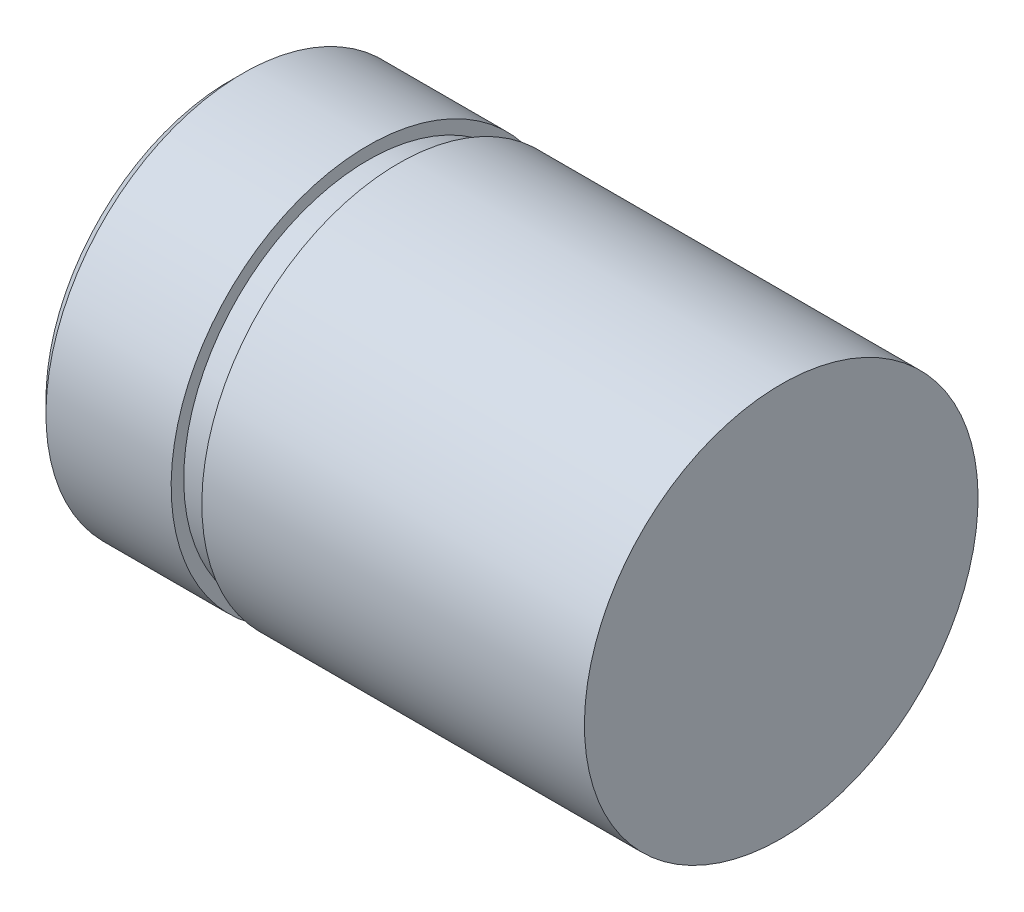
ISO-10303-21;
HEADER;
FILE_DESCRIPTION(('STEP AP214'),'2;1');
FILE_NAME('part.step','',(''),(''),'','','');
FILE_SCHEMA(('AUTOMOTIVE_DESIGN { 1 0 10303 214 1 1 1 1 }'));
ENDSEC;
DATA;
#1=APPLICATION_CONTEXT('core data for automotive mechanical design processes');
#2=APPLICATION_PROTOCOL_DEFINITION('international standard','automotive_design',2000,#1);
#3=PRODUCT_CONTEXT('',#1,'mechanical');
#4=PRODUCT('Part','Part','',(#3));
#5=PRODUCT_RELATED_PRODUCT_CATEGORY('part','',(#4));
#6=PRODUCT_DEFINITION_FORMATION('','',#4);
#7=PRODUCT_DEFINITION_CONTEXT('part definition',#1,'design');
#8=PRODUCT_DEFINITION('design','',#6,#7);
#9=PRODUCT_DEFINITION_SHAPE('','',#8);
#10=(LENGTH_UNIT() NAMED_UNIT(*) SI_UNIT(.MILLI.,.METRE.));
#11=(NAMED_UNIT(*) PLANE_ANGLE_UNIT() SI_UNIT($,.RADIAN.));
#12=(NAMED_UNIT(*) SI_UNIT($,.STERADIAN.) SOLID_ANGLE_UNIT());
#13=UNCERTAINTY_MEASURE_WITH_UNIT(LENGTH_MEASURE(1.E-05),#10,'distance_accuracy_value','');
#14=(GEOMETRIC_REPRESENTATION_CONTEXT(3) GLOBAL_UNCERTAINTY_ASSIGNED_CONTEXT((#13)) GLOBAL_UNIT_ASSIGNED_CONTEXT((#10,
#11,#12)) REPRESENTATION_CONTEXT('',''));
#15=CARTESIAN_POINT('',(0.,0.,0.));
#16=DIRECTION('',(0.,0.,1.));
#17=DIRECTION('',(1.,0.,0.));
#18=AXIS2_PLACEMENT_3D('',#15,#16,#17);
#19=CARTESIAN_POINT('',(-4.9403,-5.94360000000001,0.));
#20=DIRECTION('',(-1.,0.,0.));
#21=DIRECTION('',(0.,-1.,0.));
#22=AXIS2_PLACEMENT_3D('',#19,#20,#21);
#23=PLANE('',#22);
#24=CARTESIAN_POINT('',(-4.9403,0.,0.));
#25=DIRECTION('',(-1.,0.,0.));
#26=DIRECTION('',(0.,-1.,0.));
#27=AXIS2_PLACEMENT_3D('',#24,#25,#26);
#28=CIRCLE('',#27,5.94360000000001);
#29=CARTESIAN_POINT('',(-4.9403,-5.94360000000001,0.));
#30=VERTEX_POINT('',#29);
#31=EDGE_CURVE('E10',#30,#30,#28,.T.);
#32=ORIENTED_EDGE('',*,*,#31,.T.);
#33=EDGE_LOOP('',(#32));
#34=FACE_BOUND('',#33,.T.);
#35=ADVANCED_FACE('F34',(#34),#23,.T.);
#36=CARTESIAN_POINT('',(-4.9403,0.,0.));
#37=DIRECTION('',(1.,0.,0.));
#38=DIRECTION('',(0.,1.,0.));
#39=AXIS2_PLACEMENT_3D('',#36,#37,#38);
#40=CONICAL_SURFACE('',#39,5.94360000000001,0.78539816339744);
#41=CARTESIAN_POINT('',(-4.53390000000003,0.,0.));
#42=DIRECTION('',(-1.,0.,0.));
#43=DIRECTION('',(0.,-1.,0.));
#44=AXIS2_PLACEMENT_3D('',#41,#42,#43);
#45=CIRCLE('',#44,6.34999999999997);
#46=CARTESIAN_POINT('',(-4.53390000000003,-6.34999999999997,0.));
#47=VERTEX_POINT('',#46);
#48=EDGE_CURVE('E40',#47,#47,#45,.T.);
#49=ORIENTED_EDGE('',*,*,#48,.T.);
#50=EDGE_LOOP('',(#49));
#51=FACE_BOUND('',#50,.T.);
#52=ORIENTED_EDGE('',*,*,#31,.F.);
#53=EDGE_LOOP('',(#52));
#54=FACE_BOUND('',#53,.T.);
#55=ADVANCED_FACE('F75',(#51,#54),#40,.T.);
#56=CARTESIAN_POINT('',(12.8397,0.,0.));
#57=DIRECTION('',(-1.,0.,0.));
#58=DIRECTION('',(0.,-1.,0.));
#59=AXIS2_PLACEMENT_3D('',#56,#57,#58);
#60=CYLINDRICAL_SURFACE('',#59,6.34999999999997);
#61=CARTESIAN_POINT('',(-0.495300000000001,0.,0.));
#62=DIRECTION('',(-1.,0.,0.));
#63=DIRECTION('',(0.,-1.,0.));
#64=AXIS2_PLACEMENT_3D('',#61,#62,#63);
#65=CIRCLE('',#64,6.34999999999997);
#66=CARTESIAN_POINT('',(-0.495300000000001,-6.34999999999997,0.));
#67=VERTEX_POINT('',#66);
#68=EDGE_CURVE('E44',#67,#67,#65,.T.);
#69=ORIENTED_EDGE('',*,*,#68,.T.);
#70=EDGE_LOOP('',(#69));
#71=FACE_BOUND('',#70,.T.);
#72=ORIENTED_EDGE('',*,*,#48,.F.);
#73=EDGE_LOOP('',(#72));
#74=FACE_BOUND('',#73,.T.);
#75=ADVANCED_FACE('F79',(#71,#74),#60,.T.);
#76=CARTESIAN_POINT('',(-0.495300000000002,-5.94360000000001,0.));
#77=DIRECTION('',(1.,0.,0.));
#78=DIRECTION('',(0.,1.,0.));
#79=AXIS2_PLACEMENT_3D('',#76,#77,#78);
#80=PLANE('',#79);
#81=CARTESIAN_POINT('',(-0.495300000000004,0.,0.));
#82=DIRECTION('',(-1.,0.,0.));
#83=DIRECTION('',(0.,-1.,0.));
#84=AXIS2_PLACEMENT_3D('',#81,#82,#83);
#85=CIRCLE('',#84,5.94360000000001);
#86=CARTESIAN_POINT('',(-0.495300000000004,-5.94360000000001,0.));
#87=VERTEX_POINT('',#86);
#88=EDGE_CURVE('E48',#87,#87,#85,.T.);
#89=ORIENTED_EDGE('',*,*,#88,.T.);
#90=EDGE_LOOP('',(#89));
#91=FACE_BOUND('',#90,.T.);
#92=ORIENTED_EDGE('',*,*,#68,.F.);
#93=EDGE_LOOP('',(#92));
#94=FACE_BOUND('',#93,.T.);
#95=ADVANCED_FACE('F83',(#91,#94),#80,.T.);
#96=CARTESIAN_POINT('',(12.8397,0.,0.));
#97=DIRECTION('',(-1.,0.,0.));
#98=DIRECTION('',(0.,-1.,0.));
#99=AXIS2_PLACEMENT_3D('',#96,#97,#98);
#100=CYLINDRICAL_SURFACE('',#99,5.94360000000001);
#101=CARTESIAN_POINT('',(0.495300000000004,0.,0.));
#102=DIRECTION('',(-1.,0.,0.));
#103=DIRECTION('',(0.,-1.,0.));
#104=AXIS2_PLACEMENT_3D('',#101,#102,#103);
#105=CIRCLE('',#104,5.94360000000001);
#106=CARTESIAN_POINT('',(0.495300000000004,-5.94360000000001,0.));
#107=VERTEX_POINT('',#106);
#108=EDGE_CURVE('E53',#107,#107,#105,.T.);
#109=ORIENTED_EDGE('',*,*,#108,.T.);
#110=EDGE_LOOP('',(#109));
#111=FACE_BOUND('',#110,.T.);
#112=ORIENTED_EDGE('',*,*,#88,.F.);
#113=EDGE_LOOP('',(#112));
#114=FACE_BOUND('',#113,.T.);
#115=ADVANCED_FACE('F90',(#111,#114),#100,.T.);
#116=CARTESIAN_POINT('',(0.495300000000002,-6.34999999999997,0.));
#117=DIRECTION('',(-1.,0.,0.));
#118=DIRECTION('',(0.,-1.,0.));
#119=AXIS2_PLACEMENT_3D('',#116,#117,#118);
#120=PLANE('',#119);
#121=CARTESIAN_POINT('',(0.495300000000001,0.,0.));
#122=DIRECTION('',(-1.,0.,0.));
#123=DIRECTION('',(0.,-1.,0.));
#124=AXIS2_PLACEMENT_3D('',#121,#122,#123);
#125=CIRCLE('',#124,6.34999999999997);
#126=CARTESIAN_POINT('',(0.495300000000001,-6.34999999999997,0.));
#127=VERTEX_POINT('',#126);
#128=EDGE_CURVE('E56',#127,#127,#125,.T.);
#129=ORIENTED_EDGE('',*,*,#128,.T.);
#130=EDGE_LOOP('',(#129));
#131=FACE_BOUND('',#130,.T.);
#132=ORIENTED_EDGE('',*,*,#108,.F.);
#133=EDGE_LOOP('',(#132));
#134=FACE_BOUND('',#133,.T.);
#135=ADVANCED_FACE('F72',(#131,#134),#120,.T.);
#136=CARTESIAN_POINT('',(12.8397,0.,0.));
#137=DIRECTION('',(-1.,0.,0.));
#138=DIRECTION('',(0.,-1.,0.));
#139=AXIS2_PLACEMENT_3D('',#136,#137,#138);
#140=CYLINDRICAL_SURFACE('',#139,6.34999999999997);
#141=CARTESIAN_POINT('',(12.8397,0.,0.));
#142=DIRECTION('',(-1.,0.,0.));
#143=DIRECTION('',(0.,-1.,0.));
#144=AXIS2_PLACEMENT_3D('',#141,#142,#143);
#145=CIRCLE('',#144,6.34999999999998);
#146=CARTESIAN_POINT('',(12.8397,-6.34999999999998,0.));
#147=VERTEX_POINT('',#146);
#148=EDGE_CURVE('E59',#147,#147,#145,.T.);
#149=ORIENTED_EDGE('',*,*,#148,.T.);
#150=EDGE_LOOP('',(#149));
#151=FACE_BOUND('',#150,.T.);
#152=ORIENTED_EDGE('',*,*,#128,.F.);
#153=EDGE_LOOP('',(#152));
#154=FACE_BOUND('',#153,.T.);
#155=ADVANCED_FACE('F63',(#151,#154),#140,.T.);
#156=CARTESIAN_POINT('',(12.8397,0.,0.));
#157=DIRECTION('',(1.,0.,0.));
#158=DIRECTION('',(0.,1.,0.));
#159=AXIS2_PLACEMENT_3D('',#156,#157,#158);
#160=PLANE('',#159);
#161=ORIENTED_EDGE('',*,*,#148,.F.);
#162=EDGE_LOOP('',(#161));
#163=FACE_BOUND('',#162,.T.);
#164=ADVANCED_FACE('F66',(#163),#160,.T.);
#165=CLOSED_SHELL('',(#35,#55,#75,#95,#115,#135,#155,#164));
#166=MANIFOLD_SOLID_BREP('B2',#165);
#167=ADVANCED_BREP_SHAPE_REPRESENTATION('',(#18,#166),#14);
#168=SHAPE_DEFINITION_REPRESENTATION(#9,#167);
ENDSEC;
END-ISO-10303-21;
